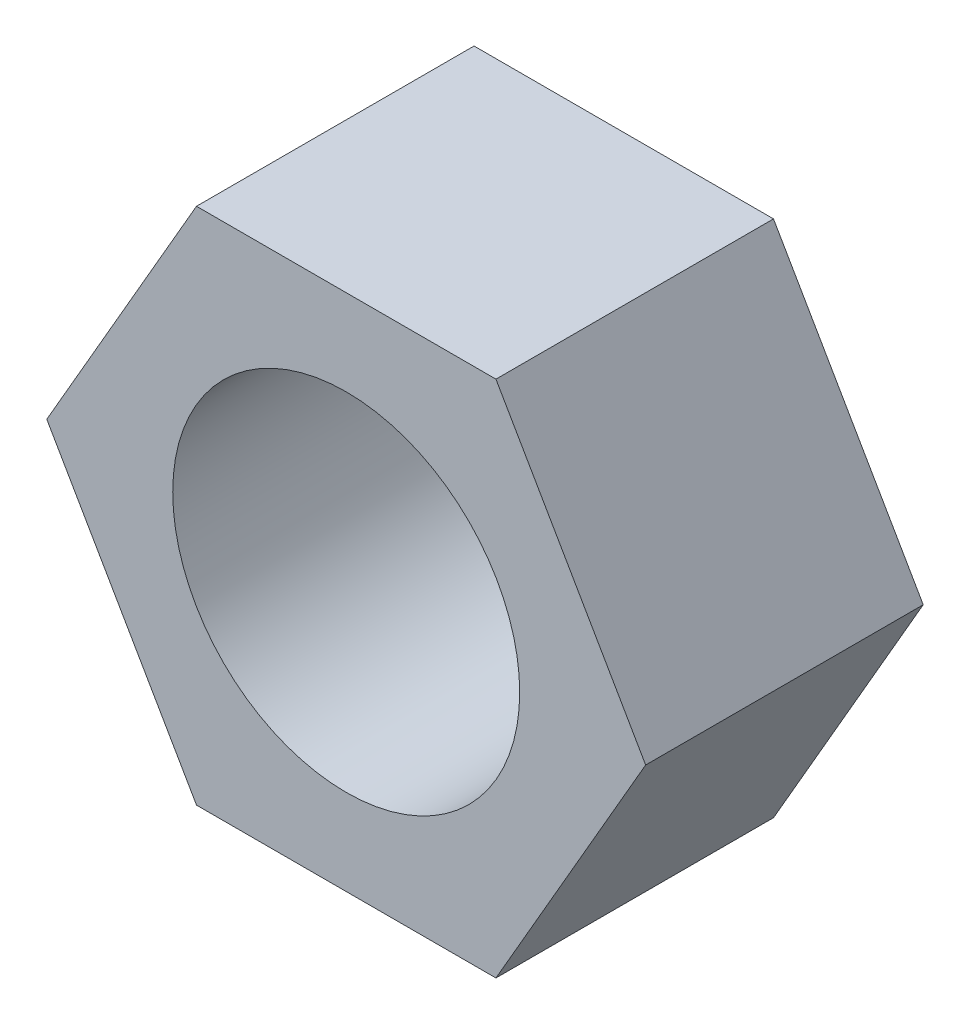
ISO-10303-21;
HEADER;
FILE_DESCRIPTION(('STEP AP214'),'2;1');
FILE_NAME('part.step','',(''),(''),'','','');
FILE_SCHEMA(('AUTOMOTIVE_DESIGN { 1 0 10303 214 1 1 1 1 }'));
ENDSEC;
DATA;
#1=APPLICATION_CONTEXT('core data for automotive mechanical design processes');
#2=APPLICATION_PROTOCOL_DEFINITION('international standard','automotive_design',2000,#1);
#3=PRODUCT_CONTEXT('',#1,'mechanical');
#4=PRODUCT('Part','Part','',(#3));
#5=PRODUCT_RELATED_PRODUCT_CATEGORY('part','',(#4));
#6=PRODUCT_DEFINITION_FORMATION('','',#4);
#7=PRODUCT_DEFINITION_CONTEXT('part definition',#1,'design');
#8=PRODUCT_DEFINITION('design','',#6,#7);
#9=PRODUCT_DEFINITION_SHAPE('','',#8);
#10=(LENGTH_UNIT() NAMED_UNIT(*) SI_UNIT(.MILLI.,.METRE.));
#11=(NAMED_UNIT(*) PLANE_ANGLE_UNIT() SI_UNIT($,.RADIAN.));
#12=(NAMED_UNIT(*) SI_UNIT($,.STERADIAN.) SOLID_ANGLE_UNIT());
#13=UNCERTAINTY_MEASURE_WITH_UNIT(LENGTH_MEASURE(1.E-05),#10,'distance_accuracy_value','');
#14=(GEOMETRIC_REPRESENTATION_CONTEXT(3) GLOBAL_UNCERTAINTY_ASSIGNED_CONTEXT((#13)) GLOBAL_UNIT_ASSIGNED_CONTEXT((#10,
#11,#12)) REPRESENTATION_CONTEXT('',''));
#15=CARTESIAN_POINT('',(0.,0.,0.));
#16=DIRECTION('',(0.,0.,1.));
#17=DIRECTION('',(1.,0.,0.));
#18=AXIS2_PLACEMENT_3D('',#15,#16,#17);
#19=CARTESIAN_POINT('',(0.,0.,2.4));
#20=DIRECTION('',(0.,0.,1.));
#21=DIRECTION('',(1.,0.,0.));
#22=AXIS2_PLACEMENT_3D('',#19,#20,#21);
#23=PLANE('',#22);
#24=DIRECTION('',(0.5,0.866025403784439,0.));
#25=VECTOR('',#24,1.);
#26=CARTESIAN_POINT('',(1.29454882094733,-2.24222433075917,2.4));
#27=LINE('',#26,#25);
#28=CARTESIAN_POINT('',(1.29454882094733,-2.24222433075917,2.4));
#29=VERTEX_POINT('',#28);
#30=CARTESIAN_POINT('',(2.58909764189467,0.,2.4));
#31=VERTEX_POINT('',#30);
#32=EDGE_CURVE('E135',#29,#31,#27,.T.);
#33=ORIENTED_EDGE('',*,*,#32,.T.);
#34=DIRECTION('',(-0.5,0.866025403784439,0.));
#35=VECTOR('',#34,1.);
#36=CARTESIAN_POINT('',(2.58909764189467,0.,2.4));
#37=LINE('',#36,#35);
#38=CARTESIAN_POINT('',(1.29454882094733,2.24222433075918,2.4));
#39=VERTEX_POINT('',#38);
#40=EDGE_CURVE('E93',#31,#39,#37,.T.);
#41=ORIENTED_EDGE('',*,*,#40,.T.);
#42=DIRECTION('',(-1.,0.,0.));
#43=VECTOR('',#42,1.);
#44=CARTESIAN_POINT('',(1.29454882094733,2.24222433075918,2.4));
#45=LINE('',#44,#43);
#46=CARTESIAN_POINT('',(-1.29454882094734,2.24222433075918,2.4));
#47=VERTEX_POINT('',#46);
#48=EDGE_CURVE('E106',#39,#47,#45,.T.);
#49=ORIENTED_EDGE('',*,*,#48,.T.);
#50=DIRECTION('',(-0.499999999999999,-0.866025403784439,0.));
#51=VECTOR('',#50,1.);
#52=CARTESIAN_POINT('',(-1.29454882094734,2.24222433075918,2.4));
#53=LINE('',#52,#51);
#54=CARTESIAN_POINT('',(-2.58909764189467,0.,2.4));
#55=VERTEX_POINT('',#54);
#56=EDGE_CURVE('E100',#47,#55,#53,.T.);
#57=ORIENTED_EDGE('',*,*,#56,.T.);
#58=DIRECTION('',(0.5,-0.866025403784439,0.));
#59=VECTOR('',#58,1.);
#60=CARTESIAN_POINT('',(-2.58909764189467,0.,2.4));
#61=LINE('',#60,#59);
#62=CARTESIAN_POINT('',(-1.29454882094734,-2.24222433075917,2.4));
#63=VERTEX_POINT('',#62);
#64=EDGE_CURVE('E104',#55,#63,#61,.T.);
#65=ORIENTED_EDGE('',*,*,#64,.T.);
#66=DIRECTION('',(1.,0.,0.));
#67=VECTOR('',#66,1.);
#68=CARTESIAN_POINT('',(-1.29454882094734,-2.24222433075917,2.4));
#69=LINE('',#68,#67);
#70=EDGE_CURVE('E56',#63,#29,#69,.T.);
#71=ORIENTED_EDGE('',*,*,#70,.T.);
#72=EDGE_LOOP('',(#33,#41,#49,#57,#65,#71));
#73=FACE_BOUND('',#72,.T.);
#74=CARTESIAN_POINT('',(0.,0.,2.4));
#75=DIRECTION('',(0.,0.,1.));
#76=DIRECTION('',(1.,0.,0.));
#77=AXIS2_PLACEMENT_3D('',#74,#75,#76);
#78=CIRCLE('',#77,1.5);
#79=CARTESIAN_POINT('',(1.5,0.,2.4));
#80=VERTEX_POINT('',#79);
#81=EDGE_CURVE('E128',#80,#80,#78,.T.);
#82=ORIENTED_EDGE('',*,*,#81,.F.);
#83=EDGE_LOOP('',(#82));
#84=FACE_BOUND('',#83,.T.);
#85=ADVANCED_FACE('F39',(#73,#84),#23,.T.);
#86=CARTESIAN_POINT('',(0.,0.,0.));
#87=DIRECTION('',(0.,0.,1.));
#88=DIRECTION('',(1.,0.,0.));
#89=AXIS2_PLACEMENT_3D('',#86,#87,#88);
#90=PLANE('',#89);
#91=DIRECTION('',(0.5,0.866025403784439,0.));
#92=VECTOR('',#91,1.);
#93=CARTESIAN_POINT('',(1.29454882094733,-2.24222433075917,0.));
#94=LINE('',#93,#92);
#95=CARTESIAN_POINT('',(1.29454882094733,-2.24222433075917,0.));
#96=VERTEX_POINT('',#95);
#97=CARTESIAN_POINT('',(2.58909764189467,0.,0.));
#98=VERTEX_POINT('',#97);
#99=EDGE_CURVE('E124',#96,#98,#94,.T.);
#100=ORIENTED_EDGE('',*,*,#99,.F.);
#101=DIRECTION('',(1.,0.,0.));
#102=VECTOR('',#101,1.);
#103=CARTESIAN_POINT('',(-1.29454882094734,-2.24222433075917,0.));
#104=LINE('',#103,#102);
#105=CARTESIAN_POINT('',(-1.29454882094734,-2.24222433075917,0.));
#106=VERTEX_POINT('',#105);
#107=EDGE_CURVE('E85',#106,#96,#104,.T.);
#108=ORIENTED_EDGE('',*,*,#107,.F.);
#109=DIRECTION('',(0.5,-0.866025403784439,0.));
#110=VECTOR('',#109,1.);
#111=CARTESIAN_POINT('',(-2.58909764189467,0.,0.));
#112=LINE('',#111,#110);
#113=CARTESIAN_POINT('',(-2.58909764189467,0.,0.));
#114=VERTEX_POINT('',#113);
#115=EDGE_CURVE('E79',#114,#106,#112,.T.);
#116=ORIENTED_EDGE('',*,*,#115,.F.);
#117=DIRECTION('',(-0.499999999999999,-0.866025403784439,0.));
#118=VECTOR('',#117,1.);
#119=CARTESIAN_POINT('',(-1.29454882094734,2.24222433075918,0.));
#120=LINE('',#119,#118);
#121=CARTESIAN_POINT('',(-1.29454882094734,2.24222433075918,0.));
#122=VERTEX_POINT('',#121);
#123=EDGE_CURVE('E114',#122,#114,#120,.T.);
#124=ORIENTED_EDGE('',*,*,#123,.F.);
#125=DIRECTION('',(-1.,0.,0.));
#126=VECTOR('',#125,1.);
#127=CARTESIAN_POINT('',(1.29454882094733,2.24222433075918,0.));
#128=LINE('',#127,#126);
#129=CARTESIAN_POINT('',(1.29454882094733,2.24222433075918,0.));
#130=VERTEX_POINT('',#129);
#131=EDGE_CURVE('E130',#130,#122,#128,.T.);
#132=ORIENTED_EDGE('',*,*,#131,.F.);
#133=DIRECTION('',(-0.5,0.866025403784439,0.));
#134=VECTOR('',#133,1.);
#135=CARTESIAN_POINT('',(2.58909764189467,0.,0.));
#136=LINE('',#135,#134);
#137=EDGE_CURVE('E127',#98,#130,#136,.T.);
#138=ORIENTED_EDGE('',*,*,#137,.F.);
#139=EDGE_LOOP('',(#100,#108,#116,#124,#132,#138));
#140=FACE_BOUND('',#139,.T.);
#141=CARTESIAN_POINT('',(0.,0.,0.));
#142=DIRECTION('',(0.,0.,1.));
#143=DIRECTION('',(1.,0.,0.));
#144=AXIS2_PLACEMENT_3D('',#141,#142,#143);
#145=CIRCLE('',#144,1.5);
#146=CARTESIAN_POINT('',(1.5,0.,0.));
#147=VERTEX_POINT('',#146);
#148=EDGE_CURVE('E246',#147,#147,#145,.T.);
#149=ORIENTED_EDGE('',*,*,#148,.T.);
#150=EDGE_LOOP('',(#149));
#151=FACE_BOUND('',#150,.T.);
#152=ADVANCED_FACE('F144',(#140,#151),#90,.F.);
#153=CARTESIAN_POINT('',(1.29454882094733,-2.24222433075917,2.4));
#154=DIRECTION('',(-0.866025403784439,0.5,0.));
#155=DIRECTION('',(-0.5,-0.866025403784439,0.));
#156=AXIS2_PLACEMENT_3D('',#153,#154,#155);
#157=PLANE('',#156);
#158=ORIENTED_EDGE('',*,*,#99,.T.);
#159=DIRECTION('',(0.,0.,-1.));
#160=VECTOR('',#159,1.);
#161=CARTESIAN_POINT('',(2.58909764189467,0.,2.4));
#162=LINE('',#161,#160);
#163=EDGE_CURVE('E11',#31,#98,#162,.T.);
#164=ORIENTED_EDGE('',*,*,#163,.F.);
#165=ORIENTED_EDGE('',*,*,#32,.F.);
#166=DIRECTION('',(0.,0.,-1.));
#167=VECTOR('',#166,1.);
#168=CARTESIAN_POINT('',(1.29454882094733,-2.24222433075917,2.4));
#169=LINE('',#168,#167);
#170=EDGE_CURVE('E120',#29,#96,#169,.T.);
#171=ORIENTED_EDGE('',*,*,#170,.T.);
#172=EDGE_LOOP('',(#158,#164,#165,#171));
#173=FACE_BOUND('',#172,.T.);
#174=ADVANCED_FACE('F41',(#173),#157,.F.);
#175=CARTESIAN_POINT('',(2.58909764189467,0.,2.4));
#176=DIRECTION('',(-0.866025403784439,-0.5,0.));
#177=DIRECTION('',(0.5,-0.866025403784439,0.));
#178=AXIS2_PLACEMENT_3D('',#175,#176,#177);
#179=PLANE('',#178);
#180=ORIENTED_EDGE('',*,*,#137,.T.);
#181=DIRECTION('',(0.,0.,-1.));
#182=VECTOR('',#181,1.);
#183=CARTESIAN_POINT('',(1.29454882094733,2.24222433075918,2.4));
#184=LINE('',#183,#182);
#185=EDGE_CURVE('E48',#39,#130,#184,.T.);
#186=ORIENTED_EDGE('',*,*,#185,.F.);
#187=ORIENTED_EDGE('',*,*,#40,.F.);
#188=ORIENTED_EDGE('',*,*,#163,.T.);
#189=EDGE_LOOP('',(#180,#186,#187,#188));
#190=FACE_BOUND('',#189,.T.);
#191=ADVANCED_FACE('F169',(#190),#179,.F.);
#192=CARTESIAN_POINT('',(1.29454882094733,2.24222433075918,2.4));
#193=DIRECTION('',(0.,-1.,0.));
#194=DIRECTION('',(0.,0.,-1.));
#195=AXIS2_PLACEMENT_3D('',#192,#193,#194);
#196=PLANE('',#195);
#197=ORIENTED_EDGE('',*,*,#131,.T.);
#198=DIRECTION('',(0.,0.,-1.));
#199=VECTOR('',#198,1.);
#200=CARTESIAN_POINT('',(-1.29454882094734,2.24222433075918,2.4));
#201=LINE('',#200,#199);
#202=EDGE_CURVE('E115',#47,#122,#201,.T.);
#203=ORIENTED_EDGE('',*,*,#202,.F.);
#204=ORIENTED_EDGE('',*,*,#48,.F.);
#205=ORIENTED_EDGE('',*,*,#185,.T.);
#206=EDGE_LOOP('',(#197,#203,#204,#205));
#207=FACE_BOUND('',#206,.T.);
#208=ADVANCED_FACE('F141',(#207),#196,.F.);
#209=CARTESIAN_POINT('',(-1.29454882094734,2.24222433075918,2.4));
#210=DIRECTION('',(0.866025403784439,-0.499999999999999,0.));
#211=DIRECTION('',(0.499999999999999,0.866025403784439,0.));
#212=AXIS2_PLACEMENT_3D('',#209,#210,#211);
#213=PLANE('',#212);
#214=ORIENTED_EDGE('',*,*,#123,.T.);
#215=DIRECTION('',(0.,0.,-1.));
#216=VECTOR('',#215,1.);
#217=CARTESIAN_POINT('',(-2.58909764189467,0.,2.4));
#218=LINE('',#217,#216);
#219=EDGE_CURVE('E111',#55,#114,#218,.T.);
#220=ORIENTED_EDGE('',*,*,#219,.F.);
#221=ORIENTED_EDGE('',*,*,#56,.F.);
#222=ORIENTED_EDGE('',*,*,#202,.T.);
#223=EDGE_LOOP('',(#214,#220,#221,#222));
#224=FACE_BOUND('',#223,.T.);
#225=ADVANCED_FACE('F112',(#224),#213,.F.);
#226=CARTESIAN_POINT('',(-2.58909764189467,0.,2.4));
#227=DIRECTION('',(0.866025403784439,0.5,0.));
#228=DIRECTION('',(-0.5,0.866025403784439,0.));
#229=AXIS2_PLACEMENT_3D('',#226,#227,#228);
#230=PLANE('',#229);
#231=ORIENTED_EDGE('',*,*,#115,.T.);
#232=DIRECTION('',(0.,0.,-1.));
#233=VECTOR('',#232,1.);
#234=CARTESIAN_POINT('',(-1.29454882094734,-2.24222433075917,2.4));
#235=LINE('',#234,#233);
#236=EDGE_CURVE('E116',#63,#106,#235,.T.);
#237=ORIENTED_EDGE('',*,*,#236,.F.);
#238=ORIENTED_EDGE('',*,*,#64,.F.);
#239=ORIENTED_EDGE('',*,*,#219,.T.);
#240=EDGE_LOOP('',(#231,#237,#238,#239));
#241=FACE_BOUND('',#240,.T.);
#242=ADVANCED_FACE('F118',(#241),#230,.F.);
#243=CARTESIAN_POINT('',(-1.29454882094734,-2.24222433075917,2.4));
#244=DIRECTION('',(0.,1.,0.));
#245=DIRECTION('',(0.,0.,1.));
#246=AXIS2_PLACEMENT_3D('',#243,#244,#245);
#247=PLANE('',#246);
#248=ORIENTED_EDGE('',*,*,#107,.T.);
#249=ORIENTED_EDGE('',*,*,#170,.F.);
#250=ORIENTED_EDGE('',*,*,#70,.F.);
#251=ORIENTED_EDGE('',*,*,#236,.T.);
#252=EDGE_LOOP('',(#248,#249,#250,#251));
#253=FACE_BOUND('',#252,.T.);
#254=ADVANCED_FACE('F149',(#253),#247,.F.);
#255=CARTESIAN_POINT('',(0.,0.,2.4));
#256=DIRECTION('',(0.,0.,-1.));
#257=DIRECTION('',(-1.,0.,0.));
#258=AXIS2_PLACEMENT_3D('',#255,#256,#257);
#259=CYLINDRICAL_SURFACE('',#258,1.5);
#260=ORIENTED_EDGE('',*,*,#81,.T.);
#261=EDGE_LOOP('',(#260));
#262=FACE_BOUND('',#261,.T.);
#263=ORIENTED_EDGE('',*,*,#148,.F.);
#264=EDGE_LOOP('',(#263));
#265=FACE_BOUND('',#264,.T.);
#266=ADVANCED_FACE('F151',(#262,#265),#259,.F.);
#267=CLOSED_SHELL('',(#85,#152,#174,#191,#208,#225,#242,#254,#266));
#268=MANIFOLD_SOLID_BREP('B2',#267);
#269=ADVANCED_BREP_SHAPE_REPRESENTATION('',(#18,#268),#14);
#270=SHAPE_DEFINITION_REPRESENTATION(#9,#269);
ENDSEC;
END-ISO-10303-21;
